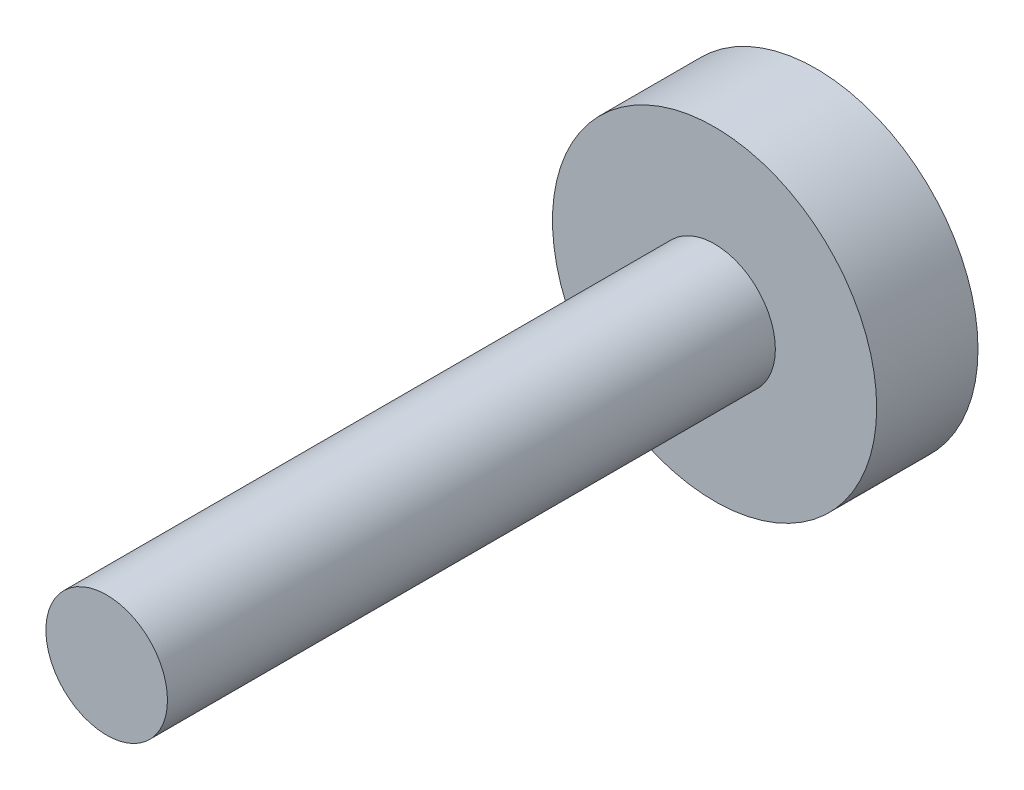
ISO-10303-21;
HEADER;
FILE_DESCRIPTION(('STEP AP214'),'2;1');
FILE_NAME('part.step','',(''),(''),'','','');
FILE_SCHEMA(('AUTOMOTIVE_DESIGN { 1 0 10303 214 1 1 1 1 }'));
ENDSEC;
DATA;
#1=APPLICATION_CONTEXT('core data for automotive mechanical design processes');
#2=APPLICATION_PROTOCOL_DEFINITION('international standard','automotive_design',2000,#1);
#3=PRODUCT_CONTEXT('',#1,'mechanical');
#4=PRODUCT('Part','Part','',(#3));
#5=PRODUCT_RELATED_PRODUCT_CATEGORY('part','',(#4));
#6=PRODUCT_DEFINITION_FORMATION('','',#4);
#7=PRODUCT_DEFINITION_CONTEXT('part definition',#1,'design');
#8=PRODUCT_DEFINITION('design','',#6,#7);
#9=PRODUCT_DEFINITION_SHAPE('','',#8);
#10=(LENGTH_UNIT() NAMED_UNIT(*) SI_UNIT(.MILLI.,.METRE.));
#11=(NAMED_UNIT(*) PLANE_ANGLE_UNIT() SI_UNIT($,.RADIAN.));
#12=(NAMED_UNIT(*) SI_UNIT($,.STERADIAN.) SOLID_ANGLE_UNIT());
#13=UNCERTAINTY_MEASURE_WITH_UNIT(LENGTH_MEASURE(1.E-05),#10,'distance_accuracy_value','');
#14=(GEOMETRIC_REPRESENTATION_CONTEXT(3) GLOBAL_UNCERTAINTY_ASSIGNED_CONTEXT((#13)) GLOBAL_UNIT_ASSIGNED_CONTEXT((#10,
#11,#12)) REPRESENTATION_CONTEXT('',''));
#15=CARTESIAN_POINT('',(0.,0.,0.));
#16=DIRECTION('',(0.,0.,1.));
#17=DIRECTION('',(1.,0.,0.));
#18=AXIS2_PLACEMENT_3D('',#15,#16,#17);
#19=CARTESIAN_POINT('',(0.,0.,2.5));
#20=DIRECTION('',(0.,0.,-1.));
#21=DIRECTION('',(-1.,0.,0.));
#22=AXIS2_PLACEMENT_3D('',#19,#20,#21);
#23=CYLINDRICAL_SURFACE('',#22,4.);
#24=CARTESIAN_POINT('',(0.,0.,2.5));
#25=DIRECTION('',(0.,0.,1.));
#26=DIRECTION('',(1.,0.,0.));
#27=AXIS2_PLACEMENT_3D('',#24,#25,#26);
#28=CIRCLE('',#27,4.);
#29=CARTESIAN_POINT('',(4.,0.,2.5));
#30=VERTEX_POINT('',#29);
#31=EDGE_CURVE('E41',#30,#30,#28,.T.);
#32=ORIENTED_EDGE('',*,*,#31,.F.);
#33=EDGE_LOOP('',(#32));
#34=FACE_BOUND('',#33,.T.);
#35=CARTESIAN_POINT('',(0.,0.,0.));
#36=DIRECTION('',(0.,0.,1.));
#37=DIRECTION('',(1.,0.,0.));
#38=AXIS2_PLACEMENT_3D('',#35,#36,#37);
#39=CIRCLE('',#38,4.);
#40=CARTESIAN_POINT('',(4.,0.,0.));
#41=VERTEX_POINT('',#40);
#42=EDGE_CURVE('E37',#41,#41,#39,.T.);
#43=ORIENTED_EDGE('',*,*,#42,.T.);
#44=EDGE_LOOP('',(#43));
#45=FACE_BOUND('',#44,.T.);
#46=ADVANCED_FACE('F34',(#34,#45),#23,.T.);
#47=CARTESIAN_POINT('',(0.,0.,2.5));
#48=DIRECTION('',(0.,0.,1.));
#49=DIRECTION('',(1.,0.,0.));
#50=AXIS2_PLACEMENT_3D('',#47,#48,#49);
#51=PLANE('',#50);
#52=CARTESIAN_POINT('',(0.,0.,2.5));
#53=DIRECTION('',(0.,0.,1.));
#54=DIRECTION('',(1.,0.,0.));
#55=AXIS2_PLACEMENT_3D('',#52,#53,#54);
#56=CIRCLE('',#55,1.5);
#57=CARTESIAN_POINT('',(1.5,0.,2.5));
#58=VERTEX_POINT('',#57);
#59=EDGE_CURVE('E10',#58,#58,#56,.T.);
#60=ORIENTED_EDGE('',*,*,#59,.F.);
#61=EDGE_LOOP('',(#60));
#62=FACE_BOUND('',#61,.T.);
#63=ORIENTED_EDGE('',*,*,#31,.T.);
#64=EDGE_LOOP('',(#63));
#65=FACE_BOUND('',#64,.T.);
#66=ADVANCED_FACE('F58',(#62,#65),#51,.T.);
#67=CARTESIAN_POINT('',(0.,0.,0.));
#68=DIRECTION('',(0.,0.,1.));
#69=DIRECTION('',(1.,0.,0.));
#70=AXIS2_PLACEMENT_3D('',#67,#68,#69);
#71=PLANE('',#70);
#72=ORIENTED_EDGE('',*,*,#42,.F.);
#73=EDGE_LOOP('',(#72));
#74=FACE_BOUND('',#73,.T.);
#75=ADVANCED_FACE('F55',(#74),#71,.F.);
#76=CARTESIAN_POINT('',(0.,0.,17.5));
#77=DIRECTION('',(0.,0.,-1.));
#78=DIRECTION('',(-1.,0.,0.));
#79=AXIS2_PLACEMENT_3D('',#76,#77,#78);
#80=CYLINDRICAL_SURFACE('',#79,1.5);
#81=CARTESIAN_POINT('',(0.,0.,17.5));
#82=DIRECTION('',(0.,0.,1.));
#83=DIRECTION('',(1.,0.,0.));
#84=AXIS2_PLACEMENT_3D('',#81,#82,#83);
#85=CIRCLE('',#84,1.5);
#86=CARTESIAN_POINT('',(1.5,0.,17.5));
#87=VERTEX_POINT('',#86);
#88=EDGE_CURVE('E47',#87,#87,#85,.T.);
#89=ORIENTED_EDGE('',*,*,#88,.F.);
#90=EDGE_LOOP('',(#89));
#91=FACE_BOUND('',#90,.T.);
#92=ORIENTED_EDGE('',*,*,#59,.T.);
#93=EDGE_LOOP('',(#92));
#94=FACE_BOUND('',#93,.T.);
#95=ADVANCED_FACE('F57',(#91,#94),#80,.T.);
#96=CARTESIAN_POINT('',(0.,0.,17.5));
#97=DIRECTION('',(0.,0.,1.));
#98=DIRECTION('',(1.,0.,0.));
#99=AXIS2_PLACEMENT_3D('',#96,#97,#98);
#100=PLANE('',#99);
#101=ORIENTED_EDGE('',*,*,#88,.T.);
#102=EDGE_LOOP('',(#101));
#103=FACE_BOUND('',#102,.T.);
#104=ADVANCED_FACE('F63',(#103),#100,.T.);
#105=CLOSED_SHELL('',(#46,#66,#75,#95,#104));
#106=MANIFOLD_SOLID_BREP('B2',#105);
#107=ADVANCED_BREP_SHAPE_REPRESENTATION('',(#18,#106),#14);
#108=SHAPE_DEFINITION_REPRESENTATION(#9,#107);
ENDSEC;
END-ISO-10303-21;
